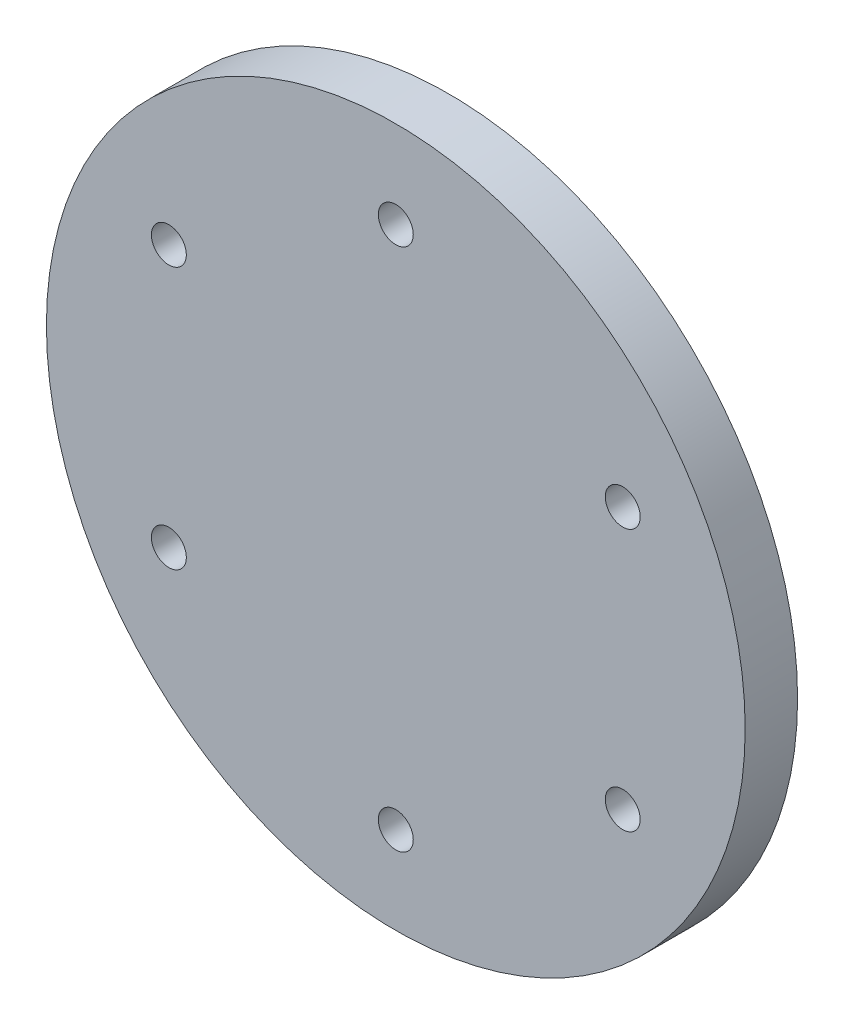
ISO-10303-21;
HEADER;
FILE_DESCRIPTION(('STEP AP214'),'2;1');
FILE_NAME('part.step','',(''),(''),'','','');
FILE_SCHEMA(('AUTOMOTIVE_DESIGN { 1 0 10303 214 1 1 1 1 }'));
ENDSEC;
DATA;
#1=APPLICATION_CONTEXT('core data for automotive mechanical design processes');
#2=APPLICATION_PROTOCOL_DEFINITION('international standard','automotive_design',2000,#1);
#3=PRODUCT_CONTEXT('',#1,'mechanical');
#4=PRODUCT('Part','Part','',(#3));
#5=PRODUCT_RELATED_PRODUCT_CATEGORY('part','',(#4));
#6=PRODUCT_DEFINITION_FORMATION('','',#4);
#7=PRODUCT_DEFINITION_CONTEXT('part definition',#1,'design');
#8=PRODUCT_DEFINITION('design','',#6,#7);
#9=PRODUCT_DEFINITION_SHAPE('','',#8);
#10=(LENGTH_UNIT() NAMED_UNIT(*) SI_UNIT(.MILLI.,.METRE.));
#11=(NAMED_UNIT(*) PLANE_ANGLE_UNIT() SI_UNIT($,.RADIAN.));
#12=(NAMED_UNIT(*) SI_UNIT($,.STERADIAN.) SOLID_ANGLE_UNIT());
#13=UNCERTAINTY_MEASURE_WITH_UNIT(LENGTH_MEASURE(1.E-05),#10,'distance_accuracy_value','');
#14=(GEOMETRIC_REPRESENTATION_CONTEXT(3) GLOBAL_UNCERTAINTY_ASSIGNED_CONTEXT((#13)) GLOBAL_UNIT_ASSIGNED_CONTEXT((#10,
#11,#12)) REPRESENTATION_CONTEXT('',''));
#15=CARTESIAN_POINT('',(0.,0.,0.));
#16=DIRECTION('',(0.,0.,1.));
#17=DIRECTION('',(1.,0.,0.));
#18=AXIS2_PLACEMENT_3D('',#15,#16,#17);
#19=CARTESIAN_POINT('',(0.,0.,6.));
#20=DIRECTION('',(0.,0.,-1.));
#21=DIRECTION('',(-1.,0.,0.));
#22=AXIS2_PLACEMENT_3D('',#19,#20,#21);
#23=CYLINDRICAL_SURFACE('',#22,40.);
#24=CARTESIAN_POINT('',(0.,0.,6.));
#25=DIRECTION('',(0.,0.,1.));
#26=DIRECTION('',(1.,0.,0.));
#27=AXIS2_PLACEMENT_3D('',#24,#25,#26);
#28=CIRCLE('',#27,40.);
#29=CARTESIAN_POINT('',(40.,0.,6.));
#30=VERTEX_POINT('',#29);
#31=EDGE_CURVE('E10',#30,#30,#28,.T.);
#32=ORIENTED_EDGE('',*,*,#31,.F.);
#33=EDGE_LOOP('',(#32));
#34=FACE_BOUND('',#33,.T.);
#35=CARTESIAN_POINT('',(0.,0.,0.));
#36=DIRECTION('',(0.,0.,1.));
#37=DIRECTION('',(1.,0.,0.));
#38=AXIS2_PLACEMENT_3D('',#35,#36,#37);
#39=CIRCLE('',#38,40.);
#40=CARTESIAN_POINT('',(40.,0.,0.));
#41=VERTEX_POINT('',#40);
#42=EDGE_CURVE('E34',#41,#41,#39,.T.);
#43=ORIENTED_EDGE('',*,*,#42,.T.);
#44=EDGE_LOOP('',(#43));
#45=FACE_BOUND('',#44,.T.);
#46=ADVANCED_FACE('F31',(#34,#45),#23,.T.);
#47=CARTESIAN_POINT('',(0.,0.,6.));
#48=DIRECTION('',(0.,0.,1.));
#49=DIRECTION('',(1.,0.,0.));
#50=AXIS2_PLACEMENT_3D('',#47,#48,#49);
#51=PLANE('',#50);
#52=CARTESIAN_POINT('',(-25.980762113533,15.0000000000003,6.));
#53=DIRECTION('',(0.,0.,1.));
#54=DIRECTION('',(1.,0.,0.));
#55=AXIS2_PLACEMENT_3D('',#52,#53,#54);
#56=CIRCLE('',#55,2.);
#57=CARTESIAN_POINT('',(-23.980762113533,15.0000000000003,6.));
#58=VERTEX_POINT('',#57);
#59=EDGE_CURVE('E70',#58,#58,#56,.T.);
#60=ORIENTED_EDGE('',*,*,#59,.F.);
#61=EDGE_LOOP('',(#60));
#62=FACE_BOUND('',#61,.T.);
#63=CARTESIAN_POINT('',(-25.9807621135333,-14.9999999999998,6.));
#64=DIRECTION('',(0.,0.,1.));
#65=DIRECTION('',(1.,0.,0.));
#66=AXIS2_PLACEMENT_3D('',#63,#64,#65);
#67=CIRCLE('',#66,2.);
#68=CARTESIAN_POINT('',(-23.9807621135333,-14.9999999999998,6.));
#69=VERTEX_POINT('',#68);
#70=EDGE_CURVE('E64',#69,#69,#67,.T.);
#71=ORIENTED_EDGE('',*,*,#70,.F.);
#72=EDGE_LOOP('',(#71));
#73=FACE_BOUND('',#72,.T.);
#74=CARTESIAN_POINT('',(-2.09488880330588E-13,-30.,6.));
#75=DIRECTION('',(0.,0.,1.));
#76=DIRECTION('',(1.,0.,0.));
#77=AXIS2_PLACEMENT_3D('',#74,#75,#76);
#78=CIRCLE('',#77,2.);
#79=CARTESIAN_POINT('',(1.99999999999979,-30.,6.));
#80=VERTEX_POINT('',#79);
#81=EDGE_CURVE('E58',#80,#80,#78,.T.);
#82=ORIENTED_EDGE('',*,*,#81,.F.);
#83=EDGE_LOOP('',(#82));
#84=FACE_BOUND('',#83,.T.);
#85=CARTESIAN_POINT('',(25.9807621135331,-15.0000000000001,6.));
#86=DIRECTION('',(0.,0.,1.));
#87=DIRECTION('',(1.,0.,0.));
#88=AXIS2_PLACEMENT_3D('',#85,#86,#87);
#89=CIRCLE('',#88,2.);
#90=CARTESIAN_POINT('',(27.9807621135331,-15.0000000000001,6.));
#91=VERTEX_POINT('',#90);
#92=EDGE_CURVE('E52',#91,#91,#89,.T.);
#93=ORIENTED_EDGE('',*,*,#92,.F.);
#94=EDGE_LOOP('',(#93));
#95=FACE_BOUND('',#94,.T.);
#96=CARTESIAN_POINT('',(25.9807621135332,14.9999999999999,6.));
#97=DIRECTION('',(0.,0.,1.));
#98=DIRECTION('',(1.,0.,0.));
#99=AXIS2_PLACEMENT_3D('',#96,#97,#98);
#100=CIRCLE('',#99,2.);
#101=CARTESIAN_POINT('',(27.9807621135332,14.9999999999999,6.));
#102=VERTEX_POINT('',#101);
#103=EDGE_CURVE('E46',#102,#102,#100,.T.);
#104=ORIENTED_EDGE('',*,*,#103,.F.);
#105=EDGE_LOOP('',(#104));
#106=FACE_BOUND('',#105,.T.);
#107=CARTESIAN_POINT('',(0.,30.,6.));
#108=DIRECTION('',(0.,0.,1.));
#109=DIRECTION('',(1.,0.,0.));
#110=AXIS2_PLACEMENT_3D('',#107,#108,#109);
#111=CIRCLE('',#110,2.);
#112=CARTESIAN_POINT('',(2.,30.,6.));
#113=VERTEX_POINT('',#112);
#114=EDGE_CURVE('E41',#113,#113,#111,.T.);
#115=ORIENTED_EDGE('',*,*,#114,.F.);
#116=EDGE_LOOP('',(#115));
#117=FACE_BOUND('',#116,.T.);
#118=ORIENTED_EDGE('',*,*,#31,.T.);
#119=EDGE_LOOP('',(#118));
#120=FACE_BOUND('',#119,.T.);
#121=ADVANCED_FACE('F82',(#62,#73,#84,#95,#106,#117,#120),#51,.T.);
#122=CARTESIAN_POINT('',(0.,0.,0.));
#123=DIRECTION('',(0.,0.,1.));
#124=DIRECTION('',(1.,0.,0.));
#125=AXIS2_PLACEMENT_3D('',#122,#123,#124);
#126=PLANE('',#125);
#127=CARTESIAN_POINT('',(-25.980762113533,15.0000000000003,0.));
#128=DIRECTION('',(0.,0.,1.));
#129=DIRECTION('',(1.,0.,0.));
#130=AXIS2_PLACEMENT_3D('',#127,#128,#129);
#131=CIRCLE('',#130,2.);
#132=CARTESIAN_POINT('',(-23.980762113533,15.0000000000003,0.));
#133=VERTEX_POINT('',#132);
#134=EDGE_CURVE('E73',#133,#133,#131,.T.);
#135=ORIENTED_EDGE('',*,*,#134,.T.);
#136=EDGE_LOOP('',(#135));
#137=FACE_BOUND('',#136,.T.);
#138=CARTESIAN_POINT('',(-25.9807621135333,-14.9999999999998,0.));
#139=DIRECTION('',(0.,0.,1.));
#140=DIRECTION('',(1.,0.,0.));
#141=AXIS2_PLACEMENT_3D('',#138,#139,#140);
#142=CIRCLE('',#141,2.);
#143=CARTESIAN_POINT('',(-23.9807621135333,-14.9999999999998,0.));
#144=VERTEX_POINT('',#143);
#145=EDGE_CURVE('E67',#144,#144,#142,.T.);
#146=ORIENTED_EDGE('',*,*,#145,.T.);
#147=EDGE_LOOP('',(#146));
#148=FACE_BOUND('',#147,.T.);
#149=CARTESIAN_POINT('',(-2.09488880330588E-13,-30.,0.));
#150=DIRECTION('',(0.,0.,1.));
#151=DIRECTION('',(1.,0.,0.));
#152=AXIS2_PLACEMENT_3D('',#149,#150,#151);
#153=CIRCLE('',#152,2.);
#154=CARTESIAN_POINT('',(1.99999999999979,-30.,0.));
#155=VERTEX_POINT('',#154);
#156=EDGE_CURVE('E61',#155,#155,#153,.T.);
#157=ORIENTED_EDGE('',*,*,#156,.T.);
#158=EDGE_LOOP('',(#157));
#159=FACE_BOUND('',#158,.T.);
#160=CARTESIAN_POINT('',(25.9807621135331,-15.0000000000001,0.));
#161=DIRECTION('',(0.,0.,1.));
#162=DIRECTION('',(1.,0.,0.));
#163=AXIS2_PLACEMENT_3D('',#160,#161,#162);
#164=CIRCLE('',#163,2.);
#165=CARTESIAN_POINT('',(27.9807621135331,-15.0000000000001,0.));
#166=VERTEX_POINT('',#165);
#167=EDGE_CURVE('E55',#166,#166,#164,.T.);
#168=ORIENTED_EDGE('',*,*,#167,.T.);
#169=EDGE_LOOP('',(#168));
#170=FACE_BOUND('',#169,.T.);
#171=CARTESIAN_POINT('',(25.9807621135332,14.9999999999999,0.));
#172=DIRECTION('',(0.,0.,1.));
#173=DIRECTION('',(1.,0.,0.));
#174=AXIS2_PLACEMENT_3D('',#171,#172,#173);
#175=CIRCLE('',#174,2.);
#176=CARTESIAN_POINT('',(27.9807621135332,14.9999999999999,0.));
#177=VERTEX_POINT('',#176);
#178=EDGE_CURVE('E49',#177,#177,#175,.T.);
#179=ORIENTED_EDGE('',*,*,#178,.T.);
#180=EDGE_LOOP('',(#179));
#181=FACE_BOUND('',#180,.T.);
#182=CARTESIAN_POINT('',(0.,30.,0.));
#183=DIRECTION('',(0.,0.,1.));
#184=DIRECTION('',(1.,0.,0.));
#185=AXIS2_PLACEMENT_3D('',#182,#183,#184);
#186=CIRCLE('',#185,2.);
#187=CARTESIAN_POINT('',(2.,30.,0.));
#188=VERTEX_POINT('',#187);
#189=EDGE_CURVE('E43',#188,#188,#186,.T.);
#190=ORIENTED_EDGE('',*,*,#189,.T.);
#191=EDGE_LOOP('',(#190));
#192=FACE_BOUND('',#191,.T.);
#193=ORIENTED_EDGE('',*,*,#42,.F.);
#194=EDGE_LOOP('',(#193));
#195=FACE_BOUND('',#194,.T.);
#196=ADVANCED_FACE('F85',(#137,#148,#159,#170,#181,#192,#195),#126,.F.);
#197=CARTESIAN_POINT('',(0.,30.,6.));
#198=DIRECTION('',(0.,0.,-1.));
#199=DIRECTION('',(-1.,0.,0.));
#200=AXIS2_PLACEMENT_3D('',#197,#198,#199);
#201=CYLINDRICAL_SURFACE('',#200,2.);
#202=ORIENTED_EDGE('',*,*,#114,.T.);
#203=EDGE_LOOP('',(#202));
#204=FACE_BOUND('',#203,.T.);
#205=ORIENTED_EDGE('',*,*,#189,.F.);
#206=EDGE_LOOP('',(#205));
#207=FACE_BOUND('',#206,.T.);
#208=ADVANCED_FACE('F97',(#204,#207),#201,.F.);
#209=CARTESIAN_POINT('',(25.9807621135332,14.9999999999999,6.));
#210=DIRECTION('',(0.,0.,-1.));
#211=DIRECTION('',(-1.,0.,0.));
#212=AXIS2_PLACEMENT_3D('',#209,#210,#211);
#213=CYLINDRICAL_SURFACE('',#212,2.);
#214=ORIENTED_EDGE('',*,*,#103,.T.);
#215=EDGE_LOOP('',(#214));
#216=FACE_BOUND('',#215,.T.);
#217=ORIENTED_EDGE('',*,*,#178,.F.);
#218=EDGE_LOOP('',(#217));
#219=FACE_BOUND('',#218,.T.);
#220=ADVANCED_FACE('F100',(#216,#219),#213,.F.);
#221=CARTESIAN_POINT('',(25.9807621135331,-15.0000000000001,6.));
#222=DIRECTION('',(0.,0.,-1.));
#223=DIRECTION('',(-1.,0.,0.));
#224=AXIS2_PLACEMENT_3D('',#221,#222,#223);
#225=CYLINDRICAL_SURFACE('',#224,2.);
#226=ORIENTED_EDGE('',*,*,#92,.T.);
#227=EDGE_LOOP('',(#226));
#228=FACE_BOUND('',#227,.T.);
#229=ORIENTED_EDGE('',*,*,#167,.F.);
#230=EDGE_LOOP('',(#229));
#231=FACE_BOUND('',#230,.T.);
#232=ADVANCED_FACE('F131',(#228,#231),#225,.F.);
#233=CARTESIAN_POINT('',(-2.09488880330588E-13,-30.,6.));
#234=DIRECTION('',(0.,0.,-1.));
#235=DIRECTION('',(-1.,0.,0.));
#236=AXIS2_PLACEMENT_3D('',#233,#234,#235);
#237=CYLINDRICAL_SURFACE('',#236,2.);
#238=ORIENTED_EDGE('',*,*,#81,.T.);
#239=EDGE_LOOP('',(#238));
#240=FACE_BOUND('',#239,.T.);
#241=ORIENTED_EDGE('',*,*,#156,.F.);
#242=EDGE_LOOP('',(#241));
#243=FACE_BOUND('',#242,.T.);
#244=ADVANCED_FACE('F139',(#240,#243),#237,.F.);
#245=CARTESIAN_POINT('',(-25.9807621135333,-14.9999999999998,6.));
#246=DIRECTION('',(0.,0.,-1.));
#247=DIRECTION('',(-1.,0.,0.));
#248=AXIS2_PLACEMENT_3D('',#245,#246,#247);
#249=CYLINDRICAL_SURFACE('',#248,2.);
#250=ORIENTED_EDGE('',*,*,#70,.T.);
#251=EDGE_LOOP('',(#250));
#252=FACE_BOUND('',#251,.T.);
#253=ORIENTED_EDGE('',*,*,#145,.F.);
#254=EDGE_LOOP('',(#253));
#255=FACE_BOUND('',#254,.T.);
#256=ADVANCED_FACE('F147',(#252,#255),#249,.F.);
#257=CARTESIAN_POINT('',(-25.980762113533,15.0000000000003,6.));
#258=DIRECTION('',(0.,0.,-1.));
#259=DIRECTION('',(-1.,0.,0.));
#260=AXIS2_PLACEMENT_3D('',#257,#258,#259);
#261=CYLINDRICAL_SURFACE('',#260,2.);
#262=ORIENTED_EDGE('',*,*,#59,.T.);
#263=EDGE_LOOP('',(#262));
#264=FACE_BOUND('',#263,.T.);
#265=ORIENTED_EDGE('',*,*,#134,.F.);
#266=EDGE_LOOP('',(#265));
#267=FACE_BOUND('',#266,.T.);
#268=ADVANCED_FACE('F79',(#264,#267),#261,.F.);
#269=CLOSED_SHELL('',(#46,#121,#196,#208,#220,#232,#244,#256,#268));
#270=MANIFOLD_SOLID_BREP('B2',#269);
#271=ADVANCED_BREP_SHAPE_REPRESENTATION('',(#18,#270),#14);
#272=SHAPE_DEFINITION_REPRESENTATION(#9,#271);
ENDSEC;
END-ISO-10303-21;
